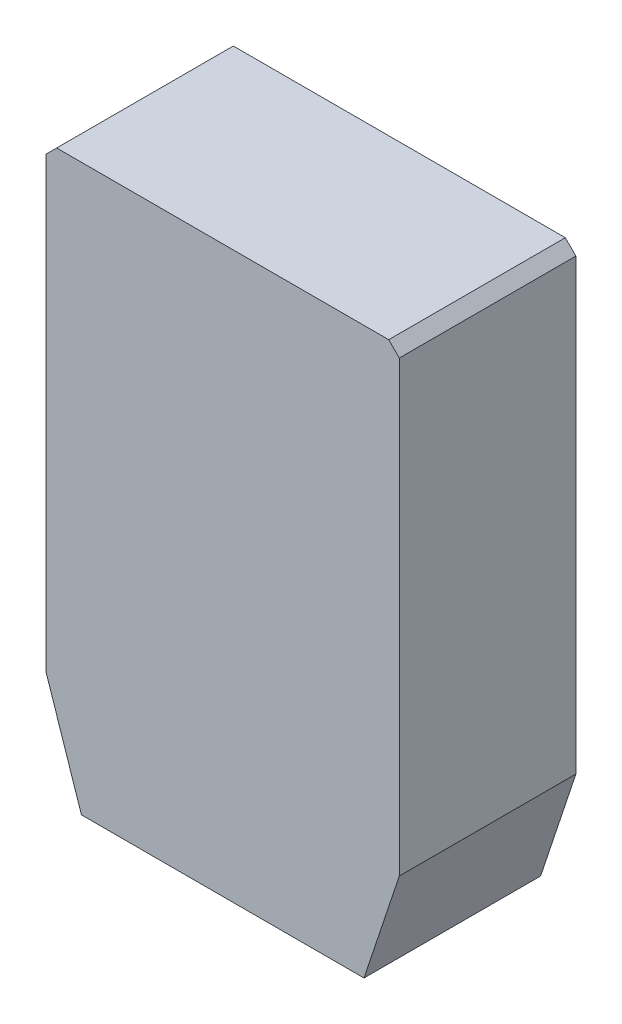
ISO-10303-21;
HEADER;
FILE_DESCRIPTION(('STEP AP214'),'2;1');
FILE_NAME('part.step','',(''),(''),'','','');
FILE_SCHEMA(('AUTOMOTIVE_DESIGN { 1 0 10303 214 1 1 1 1 }'));
ENDSEC;
DATA;
#1=APPLICATION_CONTEXT('core data for automotive mechanical design processes');
#2=APPLICATION_PROTOCOL_DEFINITION('international standard','automotive_design',2000,#1);
#3=PRODUCT_CONTEXT('',#1,'mechanical');
#4=PRODUCT('Part','Part','',(#3));
#5=PRODUCT_RELATED_PRODUCT_CATEGORY('part','',(#4));
#6=PRODUCT_DEFINITION_FORMATION('','',#4);
#7=PRODUCT_DEFINITION_CONTEXT('part definition',#1,'design');
#8=PRODUCT_DEFINITION('design','',#6,#7);
#9=PRODUCT_DEFINITION_SHAPE('','',#8);
#10=(LENGTH_UNIT() NAMED_UNIT(*) SI_UNIT(.MILLI.,.METRE.));
#11=(NAMED_UNIT(*) PLANE_ANGLE_UNIT() SI_UNIT($,.RADIAN.));
#12=(NAMED_UNIT(*) SI_UNIT($,.STERADIAN.) SOLID_ANGLE_UNIT());
#13=UNCERTAINTY_MEASURE_WITH_UNIT(LENGTH_MEASURE(1.E-05),#10,'distance_accuracy_value','');
#14=(GEOMETRIC_REPRESENTATION_CONTEXT(3) GLOBAL_UNCERTAINTY_ASSIGNED_CONTEXT((#13)) GLOBAL_UNIT_ASSIGNED_CONTEXT((#10,
#11,#12)) REPRESENTATION_CONTEXT('',''));
#15=CARTESIAN_POINT('',(0.,0.,0.));
#16=DIRECTION('',(0.,0.,1.));
#17=DIRECTION('',(1.,0.,0.));
#18=AXIS2_PLACEMENT_3D('',#15,#16,#17);
#19=CARTESIAN_POINT('',(50.,-50.,50.));
#20=DIRECTION('',(-0.948683298050514,0.316227766016838,0.));
#21=DIRECTION('',(-0.316227766016838,-0.948683298050514,0.));
#22=AXIS2_PLACEMENT_3D('',#19,#20,#21);
#23=PLANE('',#22);
#24=DIRECTION('',(0.316227766016838,0.948683298050514,0.));
#25=VECTOR('',#24,1.);
#26=CARTESIAN_POINT('',(50.,-50.,0.));
#27=LINE('',#26,#25);
#28=CARTESIAN_POINT('',(40.,-80.,0.));
#29=VERTEX_POINT('',#28);
#30=CARTESIAN_POINT('',(50.,-50.,0.));
#31=VERTEX_POINT('',#30);
#32=EDGE_CURVE('E129',#29,#31,#27,.T.);
#33=ORIENTED_EDGE('',*,*,#32,.T.);
#34=DIRECTION('',(0.,0.,-1.));
#35=VECTOR('',#34,1.);
#36=CARTESIAN_POINT('',(50.,-50.,50.));
#37=LINE('',#36,#35);
#38=CARTESIAN_POINT('',(50.,-50.,50.));
#39=VERTEX_POINT('',#38);
#40=EDGE_CURVE('E11',#39,#31,#37,.T.);
#41=ORIENTED_EDGE('',*,*,#40,.F.);
#42=DIRECTION('',(0.316227766016838,0.948683298050514,0.));
#43=VECTOR('',#42,1.);
#44=CARTESIAN_POINT('',(50.,-50.,50.));
#45=LINE('',#44,#43);
#46=CARTESIAN_POINT('',(40.,-80.,50.));
#47=VERTEX_POINT('',#46);
#48=EDGE_CURVE('E143',#47,#39,#45,.T.);
#49=ORIENTED_EDGE('',*,*,#48,.F.);
#50=DIRECTION('',(0.,0.,-1.));
#51=VECTOR('',#50,1.);
#52=CARTESIAN_POINT('',(40.,-80.,50.));
#53=LINE('',#52,#51);
#54=EDGE_CURVE('E125',#47,#29,#53,.T.);
#55=ORIENTED_EDGE('',*,*,#54,.T.);
#56=EDGE_LOOP('',(#33,#41,#49,#55));
#57=FACE_BOUND('',#56,.T.);
#58=ADVANCED_FACE('F33',(#57),#23,.F.);
#59=CARTESIAN_POINT('',(50.,77.,50.));
#60=DIRECTION('',(-1.,0.,0.));
#61=DIRECTION('',(0.,-1.,0.));
#62=AXIS2_PLACEMENT_3D('',#59,#60,#61);
#63=PLANE('',#62);
#64=DIRECTION('',(0.,1.,0.));
#65=VECTOR('',#64,1.);
#66=CARTESIAN_POINT('',(50.,77.,0.));
#67=LINE('',#66,#65);
#68=CARTESIAN_POINT('',(50.,77.,0.));
#69=VERTEX_POINT('',#68);
#70=EDGE_CURVE('E132',#31,#69,#67,.T.);
#71=ORIENTED_EDGE('',*,*,#70,.T.);
#72=DIRECTION('',(0.,0.,-1.));
#73=VECTOR('',#72,1.);
#74=CARTESIAN_POINT('',(50.,77.,50.));
#75=LINE('',#74,#73);
#76=CARTESIAN_POINT('',(50.,77.,50.));
#77=VERTEX_POINT('',#76);
#78=EDGE_CURVE('E41',#77,#69,#75,.T.);
#79=ORIENTED_EDGE('',*,*,#78,.F.);
#80=DIRECTION('',(0.,1.,0.));
#81=VECTOR('',#80,1.);
#82=CARTESIAN_POINT('',(50.,77.,50.));
#83=LINE('',#82,#81);
#84=EDGE_CURVE('E92',#39,#77,#83,.T.);
#85=ORIENTED_EDGE('',*,*,#84,.F.);
#86=ORIENTED_EDGE('',*,*,#40,.T.);
#87=EDGE_LOOP('',(#71,#79,#85,#86));
#88=FACE_BOUND('',#87,.T.);
#89=ADVANCED_FACE('F178',(#88),#63,.F.);
#90=CARTESIAN_POINT('',(47.,80.,50.));
#91=DIRECTION('',(-0.707106781186547,-0.707106781186547,0.));
#92=DIRECTION('',(0.707106781186548,-0.707106781186548,0.));
#93=AXIS2_PLACEMENT_3D('',#90,#91,#92);
#94=PLANE('',#93);
#95=DIRECTION('',(-0.707106781186547,0.707106781186547,0.));
#96=VECTOR('',#95,1.);
#97=CARTESIAN_POINT('',(47.,80.,0.));
#98=LINE('',#97,#96);
#99=CARTESIAN_POINT('',(47.,80.,0.));
#100=VERTEX_POINT('',#99);
#101=EDGE_CURVE('E134',#69,#100,#98,.T.);
#102=ORIENTED_EDGE('',*,*,#101,.T.);
#103=DIRECTION('',(0.,0.,-1.));
#104=VECTOR('',#103,1.);
#105=CARTESIAN_POINT('',(47.,80.,50.));
#106=LINE('',#105,#104);
#107=CARTESIAN_POINT('',(47.,80.,50.));
#108=VERTEX_POINT('',#107);
#109=EDGE_CURVE('E150',#108,#100,#106,.T.);
#110=ORIENTED_EDGE('',*,*,#109,.F.);
#111=DIRECTION('',(-0.707106781186547,0.707106781186547,0.));
#112=VECTOR('',#111,1.);
#113=CARTESIAN_POINT('',(47.,80.,50.));
#114=LINE('',#113,#112);
#115=EDGE_CURVE('E158',#77,#108,#114,.T.);
#116=ORIENTED_EDGE('',*,*,#115,.F.);
#117=ORIENTED_EDGE('',*,*,#78,.T.);
#118=EDGE_LOOP('',(#102,#110,#116,#117));
#119=FACE_BOUND('',#118,.T.);
#120=ADVANCED_FACE('F156',(#119),#94,.F.);
#121=CARTESIAN_POINT('',(-47.,80.,50.));
#122=DIRECTION('',(0.,-1.,0.));
#123=DIRECTION('',(0.,0.,-1.));
#124=AXIS2_PLACEMENT_3D('',#121,#122,#123);
#125=PLANE('',#124);
#126=DIRECTION('',(-1.,0.,0.));
#127=VECTOR('',#126,1.);
#128=CARTESIAN_POINT('',(-47.,80.,0.));
#129=LINE('',#128,#127);
#130=CARTESIAN_POINT('',(-47.,80.,0.));
#131=VERTEX_POINT('',#130);
#132=EDGE_CURVE('E136',#100,#131,#129,.T.);
#133=ORIENTED_EDGE('',*,*,#132,.T.);
#134=DIRECTION('',(0.,0.,-1.));
#135=VECTOR('',#134,1.);
#136=CARTESIAN_POINT('',(-47.,80.,50.));
#137=LINE('',#136,#135);
#138=CARTESIAN_POINT('',(-47.,80.,50.));
#139=VERTEX_POINT('',#138);
#140=EDGE_CURVE('E147',#139,#131,#137,.T.);
#141=ORIENTED_EDGE('',*,*,#140,.F.);
#142=DIRECTION('',(-1.,0.,0.));
#143=VECTOR('',#142,1.);
#144=CARTESIAN_POINT('',(-47.,80.,50.));
#145=LINE('',#144,#143);
#146=EDGE_CURVE('E170',#108,#139,#145,.T.);
#147=ORIENTED_EDGE('',*,*,#146,.F.);
#148=ORIENTED_EDGE('',*,*,#109,.T.);
#149=EDGE_LOOP('',(#133,#141,#147,#148));
#150=FACE_BOUND('',#149,.T.);
#151=ADVANCED_FACE('F166',(#150),#125,.F.);
#152=CARTESIAN_POINT('',(-47.,80.,50.));
#153=DIRECTION('',(0.707106781186547,-0.707106781186547,0.));
#154=DIRECTION('',(0.707106781186548,0.707106781186548,0.));
#155=AXIS2_PLACEMENT_3D('',#152,#153,#154);
#156=PLANE('',#155);
#157=DIRECTION('',(-0.707106781186547,-0.707106781186547,0.));
#158=VECTOR('',#157,1.);
#159=CARTESIAN_POINT('',(-47.,80.,0.));
#160=LINE('',#159,#158);
#161=CARTESIAN_POINT('',(-50.,77.,0.));
#162=VERTEX_POINT('',#161);
#163=EDGE_CURVE('E138',#131,#162,#160,.T.);
#164=ORIENTED_EDGE('',*,*,#163,.T.);
#165=DIRECTION('',(0.,0.,-1.));
#166=VECTOR('',#165,1.);
#167=CARTESIAN_POINT('',(-50.,77.,50.));
#168=LINE('',#167,#166);
#169=CARTESIAN_POINT('',(-50.,77.,50.));
#170=VERTEX_POINT('',#169);
#171=EDGE_CURVE('E120',#170,#162,#168,.T.);
#172=ORIENTED_EDGE('',*,*,#171,.F.);
#173=DIRECTION('',(-0.707106781186547,-0.707106781186547,0.));
#174=VECTOR('',#173,1.);
#175=CARTESIAN_POINT('',(-47.,80.,50.));
#176=LINE('',#175,#174);
#177=EDGE_CURVE('E111',#139,#170,#176,.T.);
#178=ORIENTED_EDGE('',*,*,#177,.F.);
#179=ORIENTED_EDGE('',*,*,#140,.T.);
#180=EDGE_LOOP('',(#164,#172,#178,#179));
#181=FACE_BOUND('',#180,.T.);
#182=ADVANCED_FACE('F169',(#181),#156,.F.);
#183=CARTESIAN_POINT('',(-50.,77.,50.));
#184=DIRECTION('',(1.,0.,0.));
#185=DIRECTION('',(0.,1.,0.));
#186=AXIS2_PLACEMENT_3D('',#183,#184,#185);
#187=PLANE('',#186);
#188=DIRECTION('',(0.,-1.,0.));
#189=VECTOR('',#188,1.);
#190=CARTESIAN_POINT('',(-50.,77.,0.));
#191=LINE('',#190,#189);
#192=CARTESIAN_POINT('',(-50.,-50.,0.));
#193=VERTEX_POINT('',#192);
#194=EDGE_CURVE('E119',#162,#193,#191,.T.);
#195=ORIENTED_EDGE('',*,*,#194,.T.);
#196=DIRECTION('',(0.,0.,-1.));
#197=VECTOR('',#196,1.);
#198=CARTESIAN_POINT('',(-50.,-50.,50.));
#199=LINE('',#198,#197);
#200=CARTESIAN_POINT('',(-50.,-50.,50.));
#201=VERTEX_POINT('',#200);
#202=EDGE_CURVE('E116',#201,#193,#199,.T.);
#203=ORIENTED_EDGE('',*,*,#202,.F.);
#204=DIRECTION('',(0.,-1.,0.));
#205=VECTOR('',#204,1.);
#206=CARTESIAN_POINT('',(-50.,77.,50.));
#207=LINE('',#206,#205);
#208=EDGE_CURVE('E105',#170,#201,#207,.T.);
#209=ORIENTED_EDGE('',*,*,#208,.F.);
#210=ORIENTED_EDGE('',*,*,#171,.T.);
#211=EDGE_LOOP('',(#195,#203,#209,#210));
#212=FACE_BOUND('',#211,.T.);
#213=ADVANCED_FACE('F117',(#212),#187,.F.);
#214=CARTESIAN_POINT('',(-50.,-50.,50.));
#215=DIRECTION('',(0.948683298050514,0.316227766016838,0.));
#216=DIRECTION('',(-0.316227766016838,0.948683298050514,0.));
#217=AXIS2_PLACEMENT_3D('',#214,#215,#216);
#218=PLANE('',#217);
#219=DIRECTION('',(0.316227766016838,-0.948683298050514,0.));
#220=VECTOR('',#219,1.);
#221=CARTESIAN_POINT('',(-50.,-50.,0.));
#222=LINE('',#221,#220);
#223=CARTESIAN_POINT('',(-40.,-80.,0.));
#224=VERTEX_POINT('',#223);
#225=EDGE_CURVE('E78',#193,#224,#222,.T.);
#226=ORIENTED_EDGE('',*,*,#225,.T.);
#227=DIRECTION('',(0.,0.,-1.));
#228=VECTOR('',#227,1.);
#229=CARTESIAN_POINT('',(-40.,-80.,50.));
#230=LINE('',#229,#228);
#231=CARTESIAN_POINT('',(-40.,-80.,50.));
#232=VERTEX_POINT('',#231);
#233=EDGE_CURVE('E121',#232,#224,#230,.T.);
#234=ORIENTED_EDGE('',*,*,#233,.F.);
#235=DIRECTION('',(0.316227766016838,-0.948683298050514,0.));
#236=VECTOR('',#235,1.);
#237=CARTESIAN_POINT('',(-50.,-50.,50.));
#238=LINE('',#237,#236);
#239=EDGE_CURVE('E109',#201,#232,#238,.T.);
#240=ORIENTED_EDGE('',*,*,#239,.F.);
#241=ORIENTED_EDGE('',*,*,#202,.T.);
#242=EDGE_LOOP('',(#226,#234,#240,#241));
#243=FACE_BOUND('',#242,.T.);
#244=ADVANCED_FACE('F123',(#243),#218,.F.);
#245=CARTESIAN_POINT('',(40.,-80.,50.));
#246=DIRECTION('',(0.,1.,0.));
#247=DIRECTION('',(0.,0.,1.));
#248=AXIS2_PLACEMENT_3D('',#245,#246,#247);
#249=PLANE('',#248);
#250=DIRECTION('',(1.,0.,0.));
#251=VECTOR('',#250,1.);
#252=CARTESIAN_POINT('',(40.,-80.,0.));
#253=LINE('',#252,#251);
#254=EDGE_CURVE('E84',#224,#29,#253,.T.);
#255=ORIENTED_EDGE('',*,*,#254,.T.);
#256=ORIENTED_EDGE('',*,*,#54,.F.);
#257=DIRECTION('',(1.,0.,0.));
#258=VECTOR('',#257,1.);
#259=CARTESIAN_POINT('',(40.,-80.,50.));
#260=LINE('',#259,#258);
#261=EDGE_CURVE('E49',#232,#47,#260,.T.);
#262=ORIENTED_EDGE('',*,*,#261,.F.);
#263=ORIENTED_EDGE('',*,*,#233,.T.);
#264=EDGE_LOOP('',(#255,#256,#262,#263));
#265=FACE_BOUND('',#264,.T.);
#266=ADVANCED_FACE('F194',(#265),#249,.F.);
#267=CARTESIAN_POINT('',(0.,0.,50.));
#268=DIRECTION('',(0.,0.,-1.));
#269=DIRECTION('',(-1.,0.,0.));
#270=AXIS2_PLACEMENT_3D('',#267,#268,#269);
#271=PLANE('',#270);
#272=ORIENTED_EDGE('',*,*,#48,.T.);
#273=ORIENTED_EDGE('',*,*,#84,.T.);
#274=ORIENTED_EDGE('',*,*,#115,.T.);
#275=ORIENTED_EDGE('',*,*,#146,.T.);
#276=ORIENTED_EDGE('',*,*,#177,.T.);
#277=ORIENTED_EDGE('',*,*,#208,.T.);
#278=ORIENTED_EDGE('',*,*,#239,.T.);
#279=ORIENTED_EDGE('',*,*,#261,.T.);
#280=EDGE_LOOP('',(#272,#273,#274,#275,#276,#277,#278,#279));
#281=FACE_BOUND('',#280,.T.);
#282=ADVANCED_FACE('F107',(#281),#271,.F.);
#283=CARTESIAN_POINT('',(0.,0.,0.));
#284=DIRECTION('',(0.,0.,-1.));
#285=DIRECTION('',(-1.,0.,0.));
#286=AXIS2_PLACEMENT_3D('',#283,#284,#285);
#287=PLANE('',#286);
#288=ORIENTED_EDGE('',*,*,#32,.F.);
#289=ORIENTED_EDGE('',*,*,#254,.F.);
#290=ORIENTED_EDGE('',*,*,#225,.F.);
#291=ORIENTED_EDGE('',*,*,#194,.F.);
#292=ORIENTED_EDGE('',*,*,#163,.F.);
#293=ORIENTED_EDGE('',*,*,#132,.F.);
#294=ORIENTED_EDGE('',*,*,#101,.F.);
#295=ORIENTED_EDGE('',*,*,#70,.F.);
#296=EDGE_LOOP('',(#288,#289,#290,#291,#292,#293,#294,#295));
#297=FACE_BOUND('',#296,.T.);
#298=ADVANCED_FACE('F162',(#297),#287,.T.);
#299=CLOSED_SHELL('',(#58,#89,#120,#151,#182,#213,#244,#266,#282,#298));
#300=MANIFOLD_SOLID_BREP('B2',#299);
#301=ADVANCED_BREP_SHAPE_REPRESENTATION('',(#18,#300),#14);
#302=SHAPE_DEFINITION_REPRESENTATION(#9,#301);
ENDSEC;
END-ISO-10303-21;
